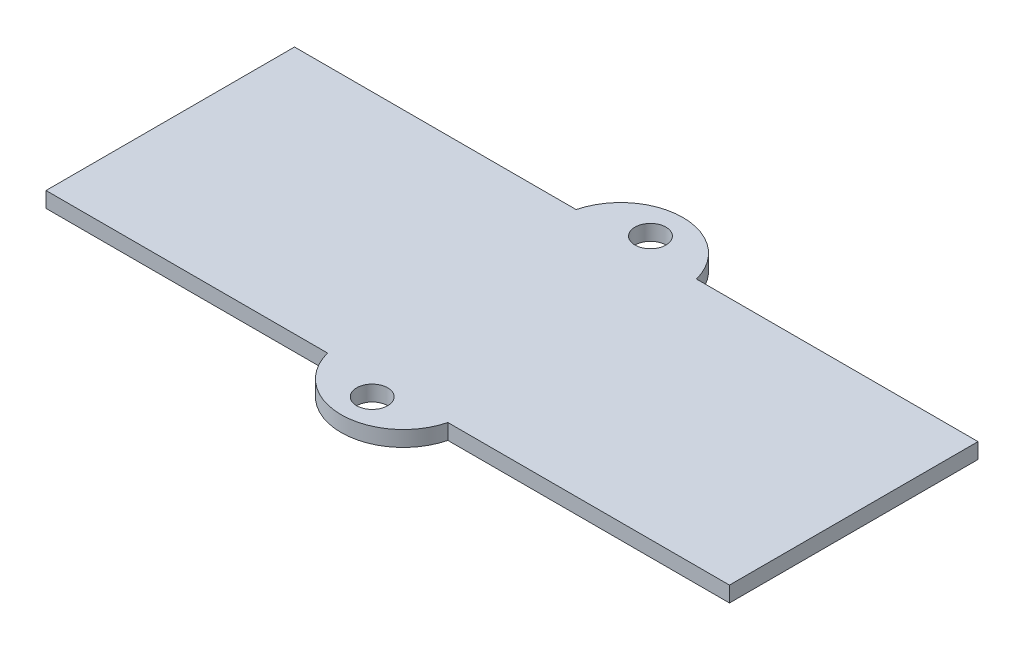
ISO-10303-21;
HEADER;
FILE_DESCRIPTION(('STEP AP214'),'2;1');
FILE_NAME('part.step','',(''),(''),'','','');
FILE_SCHEMA(('AUTOMOTIVE_DESIGN { 1 0 10303 214 1 1 1 1 }'));
ENDSEC;
DATA;
#1=APPLICATION_CONTEXT('core data for automotive mechanical design processes');
#2=APPLICATION_PROTOCOL_DEFINITION('international standard','automotive_design',2000,#1);
#3=PRODUCT_CONTEXT('',#1,'mechanical');
#4=PRODUCT('Part','Part','',(#3));
#5=PRODUCT_RELATED_PRODUCT_CATEGORY('part','',(#4));
#6=PRODUCT_DEFINITION_FORMATION('','',#4);
#7=PRODUCT_DEFINITION_CONTEXT('part definition',#1,'design');
#8=PRODUCT_DEFINITION('design','',#6,#7);
#9=PRODUCT_DEFINITION_SHAPE('','',#8);
#10=(LENGTH_UNIT() NAMED_UNIT(*) SI_UNIT(.MILLI.,.METRE.));
#11=(NAMED_UNIT(*) PLANE_ANGLE_UNIT() SI_UNIT($,.RADIAN.));
#12=(NAMED_UNIT(*) SI_UNIT($,.STERADIAN.) SOLID_ANGLE_UNIT());
#13=UNCERTAINTY_MEASURE_WITH_UNIT(LENGTH_MEASURE(1.E-05),#10,'distance_accuracy_value','');
#14=(GEOMETRIC_REPRESENTATION_CONTEXT(3) GLOBAL_UNCERTAINTY_ASSIGNED_CONTEXT((#13)) GLOBAL_UNIT_ASSIGNED_CONTEXT((#10,
#11,#12)) REPRESENTATION_CONTEXT('',''));
#15=CARTESIAN_POINT('',(0.,0.,0.));
#16=DIRECTION('',(0.,0.,1.));
#17=DIRECTION('',(1.,0.,0.));
#18=AXIS2_PLACEMENT_3D('',#15,#16,#17);
#19=CARTESIAN_POINT('',(-31.726581817433,-230.203669229127,37.9270495137206));
#20=DIRECTION('',(0.,1.,0.));
#21=DIRECTION('',(0.,0.,1.));
#22=AXIS2_PLACEMENT_3D('',#19,#20,#21);
#23=PLANE('',#22);
#24=CARTESIAN_POINT('',(-31.726581817433,-230.203669229127,69.9270495137206));
#25=DIRECTION('',(0.,1.,0.));
#26=DIRECTION('',(0.,0.,1.));
#27=AXIS2_PLACEMENT_3D('',#24,#25,#26);
#28=CIRCLE('',#27,2.00000000000001);
#29=CARTESIAN_POINT('',(-31.726581817433,-230.203669229127,71.9270495137206));
#30=VERTEX_POINT('',#29);
#31=EDGE_CURVE('E134',#30,#30,#28,.T.);
#32=ORIENTED_EDGE('',*,*,#31,.F.);
#33=EDGE_LOOP('',(#32));
#34=FACE_BOUND('',#33,.T.);
#35=DIRECTION('',(1.,0.,0.));
#36=VECTOR('',#35,1.);
#37=CARTESIAN_POINT('',(-39.4725485098478,-230.203669229127,67.9270495137206));
#38=LINE('',#37,#36);
#39=CARTESIAN_POINT('',(-75.726581817433,-230.203669229127,67.9270495137206));
#40=VERTEX_POINT('',#39);
#41=CARTESIAN_POINT('',(-39.4725485098478,-230.203669229127,67.9270495137206));
#42=VERTEX_POINT('',#41);
#43=EDGE_CURVE('E145',#40,#42,#38,.T.);
#44=ORIENTED_EDGE('',*,*,#43,.T.);
#45=CARTESIAN_POINT('',(-31.726581817433,-230.203669229127,65.9270495137206));
#46=DIRECTION('',(0.,1.,0.));
#47=DIRECTION('',(0.,0.,1.));
#48=AXIS2_PLACEMENT_3D('',#45,#46,#47);
#49=CIRCLE('',#48,8.);
#50=CARTESIAN_POINT('',(-23.9806151250181,-230.203669229127,67.9270495137206));
#51=VERTEX_POINT('',#50);
#52=EDGE_CURVE('E93',#42,#51,#49,.T.);
#53=ORIENTED_EDGE('',*,*,#52,.T.);
#54=DIRECTION('',(1.,0.,0.));
#55=VECTOR('',#54,1.);
#56=CARTESIAN_POINT('',(12.273418182567,-230.203669229127,67.9270495137206));
#57=LINE('',#56,#55);
#58=CARTESIAN_POINT('',(12.273418182567,-230.203669229127,67.9270495137206));
#59=VERTEX_POINT('',#58);
#60=EDGE_CURVE('E160',#51,#59,#57,.T.);
#61=ORIENTED_EDGE('',*,*,#60,.T.);
#62=DIRECTION('',(0.,0.,-1.));
#63=VECTOR('',#62,1.);
#64=CARTESIAN_POINT('',(12.273418182567,-230.203669229127,35.9270495137207));
#65=LINE('',#64,#63);
#66=CARTESIAN_POINT('',(12.273418182567,-230.203669229127,35.9270495137207));
#67=VERTEX_POINT('',#66);
#68=EDGE_CURVE('E173',#59,#67,#65,.T.);
#69=ORIENTED_EDGE('',*,*,#68,.T.);
#70=DIRECTION('',(-1.,0.,0.));
#71=VECTOR('',#70,1.);
#72=CARTESIAN_POINT('',(-23.9806151250182,-230.203669229127,35.9270495137207));
#73=LINE('',#72,#71);
#74=CARTESIAN_POINT('',(-23.9806151250182,-230.203669229127,35.9270495137207));
#75=VERTEX_POINT('',#74);
#76=EDGE_CURVE('E112',#67,#75,#73,.T.);
#77=ORIENTED_EDGE('',*,*,#76,.T.);
#78=CARTESIAN_POINT('',(-31.726581817433,-230.203669229127,37.9270495137206));
#79=DIRECTION('',(0.,1.,0.));
#80=DIRECTION('',(0.,0.,1.));
#81=AXIS2_PLACEMENT_3D('',#78,#79,#80);
#82=CIRCLE('',#81,8.);
#83=CARTESIAN_POINT('',(-39.4725485098478,-230.203669229127,35.9270495137207));
#84=VERTEX_POINT('',#83);
#85=EDGE_CURVE('E106',#75,#84,#82,.T.);
#86=ORIENTED_EDGE('',*,*,#85,.T.);
#87=DIRECTION('',(-1.,0.,0.));
#88=VECTOR('',#87,1.);
#89=CARTESIAN_POINT('',(-75.726581817433,-230.203669229127,35.9270495137207));
#90=LINE('',#89,#88);
#91=CARTESIAN_POINT('',(-75.726581817433,-230.203669229127,35.9270495137207));
#92=VERTEX_POINT('',#91);
#93=EDGE_CURVE('E110',#84,#92,#90,.T.);
#94=ORIENTED_EDGE('',*,*,#93,.T.);
#95=DIRECTION('',(0.,0.,1.));
#96=VECTOR('',#95,1.);
#97=CARTESIAN_POINT('',(-75.726581817433,-230.203669229127,67.9270495137206));
#98=LINE('',#97,#96);
#99=EDGE_CURVE('E50',#92,#40,#98,.T.);
#100=ORIENTED_EDGE('',*,*,#99,.T.);
#101=EDGE_LOOP('',(#44,#53,#61,#69,#77,#86,#94,#100));
#102=FACE_BOUND('',#101,.T.);
#103=CARTESIAN_POINT('',(-31.726581817433,-230.203669229127,34.0975901469188));
#104=DIRECTION('',(0.,1.,0.));
#105=DIRECTION('',(0.,0.,1.));
#106=AXIS2_PLACEMENT_3D('',#103,#104,#105);
#107=CIRCLE('',#106,2.00000000000001);
#108=CARTESIAN_POINT('',(-31.726581817433,-230.203669229127,36.0975901469188));
#109=VERTEX_POINT('',#108);
#110=EDGE_CURVE('E182',#109,#109,#107,.T.);
#111=ORIENTED_EDGE('',*,*,#110,.F.);
#112=EDGE_LOOP('',(#111));
#113=FACE_BOUND('',#112,.T.);
#114=ADVANCED_FACE('F33',(#34,#102,#113),#23,.T.);
#115=CARTESIAN_POINT('',(-31.726581817433,-232.203669229127,37.9270495137206));
#116=DIRECTION('',(0.,1.,0.));
#117=DIRECTION('',(0.,0.,1.));
#118=AXIS2_PLACEMENT_3D('',#115,#116,#117);
#119=PLANE('',#118);
#120=DIRECTION('',(1.,0.,0.));
#121=VECTOR('',#120,1.);
#122=CARTESIAN_POINT('',(-39.4725485098478,-232.203669229127,67.9270495137206));
#123=LINE('',#122,#121);
#124=CARTESIAN_POINT('',(-75.726581817433,-232.203669229127,67.9270495137206));
#125=VERTEX_POINT('',#124);
#126=CARTESIAN_POINT('',(-39.4725485098478,-232.203669229127,67.9270495137206));
#127=VERTEX_POINT('',#126);
#128=EDGE_CURVE('E130',#125,#127,#123,.T.);
#129=ORIENTED_EDGE('',*,*,#128,.F.);
#130=DIRECTION('',(0.,0.,1.));
#131=VECTOR('',#130,1.);
#132=CARTESIAN_POINT('',(-75.726581817433,-232.203669229127,67.9270495137206));
#133=LINE('',#132,#131);
#134=CARTESIAN_POINT('',(-75.726581817433,-232.203669229127,35.9270495137207));
#135=VERTEX_POINT('',#134);
#136=EDGE_CURVE('E85',#135,#125,#133,.T.);
#137=ORIENTED_EDGE('',*,*,#136,.F.);
#138=DIRECTION('',(-1.,0.,0.));
#139=VECTOR('',#138,1.);
#140=CARTESIAN_POINT('',(-75.726581817433,-232.203669229127,35.9270495137207));
#141=LINE('',#140,#139);
#142=CARTESIAN_POINT('',(-39.4725485098478,-232.203669229127,35.9270495137207));
#143=VERTEX_POINT('',#142);
#144=EDGE_CURVE('E79',#143,#135,#141,.T.);
#145=ORIENTED_EDGE('',*,*,#144,.F.);
#146=CARTESIAN_POINT('',(-31.726581817433,-232.203669229127,37.9270495137206));
#147=DIRECTION('',(0.,1.,0.));
#148=DIRECTION('',(0.,0.,1.));
#149=AXIS2_PLACEMENT_3D('',#146,#147,#148);
#150=CIRCLE('',#149,8.);
#151=CARTESIAN_POINT('',(-23.9806151250182,-232.203669229127,35.9270495137207));
#152=VERTEX_POINT('',#151);
#153=EDGE_CURVE('E120',#152,#143,#150,.T.);
#154=ORIENTED_EDGE('',*,*,#153,.F.);
#155=DIRECTION('',(-1.,0.,0.));
#156=VECTOR('',#155,1.);
#157=CARTESIAN_POINT('',(-23.9806151250182,-232.203669229127,35.9270495137207));
#158=LINE('',#157,#156);
#159=CARTESIAN_POINT('',(12.273418182567,-232.203669229127,35.9270495137207));
#160=VERTEX_POINT('',#159);
#161=EDGE_CURVE('E140',#160,#152,#158,.T.);
#162=ORIENTED_EDGE('',*,*,#161,.F.);
#163=DIRECTION('',(0.,0.,-1.));
#164=VECTOR('',#163,1.);
#165=CARTESIAN_POINT('',(12.273418182567,-232.203669229127,35.9270495137207));
#166=LINE('',#165,#164);
#167=CARTESIAN_POINT('',(12.273418182567,-232.203669229127,67.9270495137206));
#168=VERTEX_POINT('',#167);
#169=EDGE_CURVE('E138',#168,#160,#166,.T.);
#170=ORIENTED_EDGE('',*,*,#169,.F.);
#171=DIRECTION('',(1.,0.,0.));
#172=VECTOR('',#171,1.);
#173=CARTESIAN_POINT('',(12.273418182567,-232.203669229127,67.9270495137206));
#174=LINE('',#173,#172);
#175=CARTESIAN_POINT('',(-23.9806151250181,-232.203669229127,67.9270495137206));
#176=VERTEX_POINT('',#175);
#177=EDGE_CURVE('E136',#176,#168,#174,.T.);
#178=ORIENTED_EDGE('',*,*,#177,.F.);
#179=CARTESIAN_POINT('',(-31.726581817433,-232.203669229127,65.9270495137206));
#180=DIRECTION('',(0.,1.,0.));
#181=DIRECTION('',(0.,0.,1.));
#182=AXIS2_PLACEMENT_3D('',#179,#180,#181);
#183=CIRCLE('',#182,8.);
#184=EDGE_CURVE('E133',#127,#176,#183,.T.);
#185=ORIENTED_EDGE('',*,*,#184,.F.);
#186=EDGE_LOOP('',(#129,#137,#145,#154,#162,#170,#178,#185));
#187=FACE_BOUND('',#186,.T.);
#188=CARTESIAN_POINT('',(-31.726581817433,-232.203669229127,69.9270495137206));
#189=DIRECTION('',(0.,1.,0.));
#190=DIRECTION('',(0.,0.,1.));
#191=AXIS2_PLACEMENT_3D('',#188,#189,#190);
#192=CIRCLE('',#191,2.00000000000001);
#193=CARTESIAN_POINT('',(-31.726581817433,-232.203669229127,71.9270495137206));
#194=VERTEX_POINT('',#193);
#195=EDGE_CURVE('E179',#194,#194,#192,.T.);
#196=ORIENTED_EDGE('',*,*,#195,.T.);
#197=EDGE_LOOP('',(#196));
#198=FACE_BOUND('',#197,.T.);
#199=CARTESIAN_POINT('',(-31.726581817433,-232.203669229127,34.0975901469188));
#200=DIRECTION('',(0.,1.,0.));
#201=DIRECTION('',(0.,0.,1.));
#202=AXIS2_PLACEMENT_3D('',#199,#200,#201);
#203=CIRCLE('',#202,2.00000000000001);
#204=CARTESIAN_POINT('',(-31.726581817433,-232.203669229127,36.0975901469188));
#205=VERTEX_POINT('',#204);
#206=EDGE_CURVE('E185',#205,#205,#203,.T.);
#207=ORIENTED_EDGE('',*,*,#206,.T.);
#208=EDGE_LOOP('',(#207));
#209=FACE_BOUND('',#208,.T.);
#210=ADVANCED_FACE('F164',(#187,#198,#209),#119,.F.);
#211=CARTESIAN_POINT('',(-39.4725485098478,-230.203669229127,67.9270495137206));
#212=DIRECTION('',(0.,0.,-1.));
#213=DIRECTION('',(-1.,0.,0.));
#214=AXIS2_PLACEMENT_3D('',#211,#212,#213);
#215=PLANE('',#214);
#216=ORIENTED_EDGE('',*,*,#128,.T.);
#217=DIRECTION('',(0.,-1.,0.));
#218=VECTOR('',#217,1.);
#219=CARTESIAN_POINT('',(-39.4725485098478,-230.203669229127,67.9270495137206));
#220=LINE('',#219,#218);
#221=EDGE_CURVE('E11',#42,#127,#220,.T.);
#222=ORIENTED_EDGE('',*,*,#221,.F.);
#223=ORIENTED_EDGE('',*,*,#43,.F.);
#224=DIRECTION('',(0.,-1.,0.));
#225=VECTOR('',#224,1.);
#226=CARTESIAN_POINT('',(-75.726581817433,-230.203669229127,67.9270495137206));
#227=LINE('',#226,#225);
#228=EDGE_CURVE('E126',#40,#125,#227,.T.);
#229=ORIENTED_EDGE('',*,*,#228,.T.);
#230=EDGE_LOOP('',(#216,#222,#223,#229));
#231=FACE_BOUND('',#230,.T.);
#232=ADVANCED_FACE('F35',(#231),#215,.F.);
#233=CARTESIAN_POINT('',(-31.726581817433,-230.203669229127,65.9270495137206));
#234=DIRECTION('',(0.,-1.,0.));
#235=DIRECTION('',(0.,0.,-1.));
#236=AXIS2_PLACEMENT_3D('',#233,#234,#235);
#237=CYLINDRICAL_SURFACE('',#236,8.);
#238=ORIENTED_EDGE('',*,*,#184,.T.);
#239=DIRECTION('',(0.,-1.,0.));
#240=VECTOR('',#239,1.);
#241=CARTESIAN_POINT('',(-23.9806151250181,-230.203669229127,67.9270495137206));
#242=LINE('',#241,#240);
#243=EDGE_CURVE('E42',#51,#176,#242,.T.);
#244=ORIENTED_EDGE('',*,*,#243,.F.);
#245=ORIENTED_EDGE('',*,*,#52,.F.);
#246=ORIENTED_EDGE('',*,*,#221,.T.);
#247=EDGE_LOOP('',(#238,#244,#245,#246));
#248=FACE_BOUND('',#247,.T.);
#249=ADVANCED_FACE('F217',(#248),#237,.T.);
#250=CARTESIAN_POINT('',(12.273418182567,-230.203669229127,67.9270495137206));
#251=DIRECTION('',(0.,0.,-1.));
#252=DIRECTION('',(-1.,0.,0.));
#253=AXIS2_PLACEMENT_3D('',#250,#251,#252);
#254=PLANE('',#253);
#255=ORIENTED_EDGE('',*,*,#177,.T.);
#256=DIRECTION('',(0.,-1.,0.));
#257=VECTOR('',#256,1.);
#258=CARTESIAN_POINT('',(12.273418182567,-230.203669229127,67.9270495137206));
#259=LINE('',#258,#257);
#260=EDGE_CURVE('E152',#59,#168,#259,.T.);
#261=ORIENTED_EDGE('',*,*,#260,.F.);
#262=ORIENTED_EDGE('',*,*,#60,.F.);
#263=ORIENTED_EDGE('',*,*,#243,.T.);
#264=EDGE_LOOP('',(#255,#261,#262,#263));
#265=FACE_BOUND('',#264,.T.);
#266=ADVANCED_FACE('F158',(#265),#254,.F.);
#267=CARTESIAN_POINT('',(12.273418182567,-230.203669229127,35.9270495137207));
#268=DIRECTION('',(-1.,0.,0.));
#269=DIRECTION('',(0.,0.,1.));
#270=AXIS2_PLACEMENT_3D('',#267,#268,#269);
#271=PLANE('',#270);
#272=ORIENTED_EDGE('',*,*,#169,.T.);
#273=DIRECTION('',(0.,-1.,0.));
#274=VECTOR('',#273,1.);
#275=CARTESIAN_POINT('',(12.273418182567,-230.203669229127,35.9270495137207));
#276=LINE('',#275,#274);
#277=EDGE_CURVE('E149',#67,#160,#276,.T.);
#278=ORIENTED_EDGE('',*,*,#277,.F.);
#279=ORIENTED_EDGE('',*,*,#68,.F.);
#280=ORIENTED_EDGE('',*,*,#260,.T.);
#281=EDGE_LOOP('',(#272,#278,#279,#280));
#282=FACE_BOUND('',#281,.T.);
#283=ADVANCED_FACE('F169',(#282),#271,.F.);
#284=CARTESIAN_POINT('',(-23.9806151250182,-230.203669229127,35.9270495137207));
#285=DIRECTION('',(0.,0.,1.));
#286=DIRECTION('',(1.,0.,0.));
#287=AXIS2_PLACEMENT_3D('',#284,#285,#286);
#288=PLANE('',#287);
#289=ORIENTED_EDGE('',*,*,#161,.T.);
#290=DIRECTION('',(0.,-1.,0.));
#291=VECTOR('',#290,1.);
#292=CARTESIAN_POINT('',(-23.9806151250182,-230.203669229127,35.9270495137207));
#293=LINE('',#292,#291);
#294=EDGE_CURVE('E121',#75,#152,#293,.T.);
#295=ORIENTED_EDGE('',*,*,#294,.F.);
#296=ORIENTED_EDGE('',*,*,#76,.F.);
#297=ORIENTED_EDGE('',*,*,#277,.T.);
#298=EDGE_LOOP('',(#289,#295,#296,#297));
#299=FACE_BOUND('',#298,.T.);
#300=ADVANCED_FACE('F172',(#299),#288,.F.);
#301=CARTESIAN_POINT('',(-31.726581817433,-230.203669229127,37.9270495137206));
#302=DIRECTION('',(0.,-1.,0.));
#303=DIRECTION('',(0.,0.,-1.));
#304=AXIS2_PLACEMENT_3D('',#301,#302,#303);
#305=CYLINDRICAL_SURFACE('',#304,8.);
#306=ORIENTED_EDGE('',*,*,#153,.T.);
#307=DIRECTION('',(0.,-1.,0.));
#308=VECTOR('',#307,1.);
#309=CARTESIAN_POINT('',(-39.4725485098478,-230.203669229127,35.9270495137207));
#310=LINE('',#309,#308);
#311=EDGE_CURVE('E117',#84,#143,#310,.T.);
#312=ORIENTED_EDGE('',*,*,#311,.F.);
#313=ORIENTED_EDGE('',*,*,#85,.F.);
#314=ORIENTED_EDGE('',*,*,#294,.T.);
#315=EDGE_LOOP('',(#306,#312,#313,#314));
#316=FACE_BOUND('',#315,.T.);
#317=ADVANCED_FACE('F118',(#316),#305,.T.);
#318=CARTESIAN_POINT('',(-75.726581817433,-230.203669229127,35.9270495137207));
#319=DIRECTION('',(0.,0.,1.));
#320=DIRECTION('',(1.,0.,0.));
#321=AXIS2_PLACEMENT_3D('',#318,#319,#320);
#322=PLANE('',#321);
#323=ORIENTED_EDGE('',*,*,#144,.T.);
#324=DIRECTION('',(0.,-1.,0.));
#325=VECTOR('',#324,1.);
#326=CARTESIAN_POINT('',(-75.726581817433,-230.203669229127,35.9270495137207));
#327=LINE('',#326,#325);
#328=EDGE_CURVE('E122',#92,#135,#327,.T.);
#329=ORIENTED_EDGE('',*,*,#328,.F.);
#330=ORIENTED_EDGE('',*,*,#93,.F.);
#331=ORIENTED_EDGE('',*,*,#311,.T.);
#332=EDGE_LOOP('',(#323,#329,#330,#331));
#333=FACE_BOUND('',#332,.T.);
#334=ADVANCED_FACE('F124',(#333),#322,.F.);
#335=CARTESIAN_POINT('',(-75.726581817433,-230.203669229127,67.9270495137206));
#336=DIRECTION('',(1.,0.,0.));
#337=DIRECTION('',(0.,0.,-1.));
#338=AXIS2_PLACEMENT_3D('',#335,#336,#337);
#339=PLANE('',#338);
#340=ORIENTED_EDGE('',*,*,#136,.T.);
#341=ORIENTED_EDGE('',*,*,#228,.F.);
#342=ORIENTED_EDGE('',*,*,#99,.F.);
#343=ORIENTED_EDGE('',*,*,#328,.T.);
#344=EDGE_LOOP('',(#340,#341,#342,#343));
#345=FACE_BOUND('',#344,.T.);
#346=ADVANCED_FACE('F205',(#345),#339,.F.);
#347=CARTESIAN_POINT('',(-31.726581817433,-230.203669229127,69.9270495137206));
#348=DIRECTION('',(0.,-1.,0.));
#349=DIRECTION('',(0.,0.,-1.));
#350=AXIS2_PLACEMENT_3D('',#347,#348,#349);
#351=CYLINDRICAL_SURFACE('',#350,2.00000000000001);
#352=ORIENTED_EDGE('',*,*,#31,.T.);
#353=EDGE_LOOP('',(#352));
#354=FACE_BOUND('',#353,.T.);
#355=ORIENTED_EDGE('',*,*,#195,.F.);
#356=EDGE_LOOP('',(#355));
#357=FACE_BOUND('',#356,.T.);
#358=ADVANCED_FACE('F202',(#354,#357),#351,.F.);
#359=CARTESIAN_POINT('',(-31.726581817433,-230.203669229127,34.0975901469188));
#360=DIRECTION('',(0.,-1.,0.));
#361=DIRECTION('',(0.,0.,-1.));
#362=AXIS2_PLACEMENT_3D('',#359,#360,#361);
#363=CYLINDRICAL_SURFACE('',#362,2.00000000000001);
#364=ORIENTED_EDGE('',*,*,#110,.T.);
#365=EDGE_LOOP('',(#364));
#366=FACE_BOUND('',#365,.T.);
#367=ORIENTED_EDGE('',*,*,#206,.F.);
#368=EDGE_LOOP('',(#367));
#369=FACE_BOUND('',#368,.T.);
#370=ADVANCED_FACE('F191',(#366,#369),#363,.F.);
#371=CLOSED_SHELL('',(#114,#210,#232,#249,#266,#283,#300,#317,#334,#346,#358,#370));
#372=MANIFOLD_SOLID_BREP('B2',#371);
#373=ADVANCED_BREP_SHAPE_REPRESENTATION('',(#18,#372),#14);
#374=SHAPE_DEFINITION_REPRESENTATION(#9,#373);
ENDSEC;
END-ISO-10303-21;
